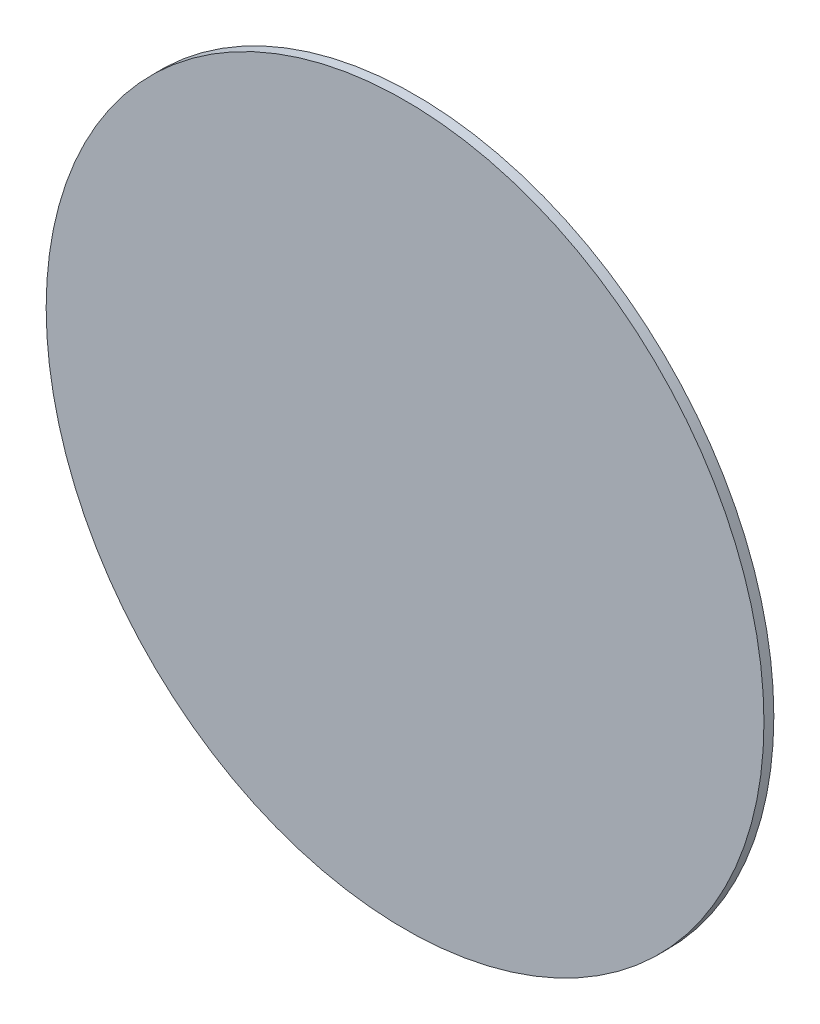
ISO-10303-21;
HEADER;
FILE_DESCRIPTION(('STEP AP214'),'2;1');
FILE_NAME('part.step','',(''),(''),'','','');
FILE_SCHEMA(('AUTOMOTIVE_DESIGN { 1 0 10303 214 1 1 1 1 }'));
ENDSEC;
DATA;
#1=APPLICATION_CONTEXT('core data for automotive mechanical design processes');
#2=APPLICATION_PROTOCOL_DEFINITION('international standard','automotive_design',2000,#1);
#3=PRODUCT_CONTEXT('',#1,'mechanical');
#4=PRODUCT('Part','Part','',(#3));
#5=PRODUCT_RELATED_PRODUCT_CATEGORY('part','',(#4));
#6=PRODUCT_DEFINITION_FORMATION('','',#4);
#7=PRODUCT_DEFINITION_CONTEXT('part definition',#1,'design');
#8=PRODUCT_DEFINITION('design','',#6,#7);
#9=PRODUCT_DEFINITION_SHAPE('','',#8);
#10=(LENGTH_UNIT() NAMED_UNIT(*) SI_UNIT(.MILLI.,.METRE.));
#11=(NAMED_UNIT(*) PLANE_ANGLE_UNIT() SI_UNIT($,.RADIAN.));
#12=(NAMED_UNIT(*) SI_UNIT($,.STERADIAN.) SOLID_ANGLE_UNIT());
#13=UNCERTAINTY_MEASURE_WITH_UNIT(LENGTH_MEASURE(1.E-05),#10,'distance_accuracy_value','');
#14=(GEOMETRIC_REPRESENTATION_CONTEXT(3) GLOBAL_UNCERTAINTY_ASSIGNED_CONTEXT((#13)) GLOBAL_UNIT_ASSIGNED_CONTEXT((#10,
#11,#12)) REPRESENTATION_CONTEXT('',''));
#15=CARTESIAN_POINT('',(0.,0.,0.));
#16=DIRECTION('',(0.,0.,1.));
#17=DIRECTION('',(1.,0.,0.));
#18=AXIS2_PLACEMENT_3D('',#15,#16,#17);
#19=CARTESIAN_POINT('',(0.,0.,10.));
#20=DIRECTION('',(0.,0.,-1.));
#21=DIRECTION('',(-1.,0.,0.));
#22=AXIS2_PLACEMENT_3D('',#19,#20,#21);
#23=CYLINDRICAL_SURFACE('',#22,363.2);
#24=CARTESIAN_POINT('',(0.,0.,10.));
#25=DIRECTION('',(0.,0.,1.));
#26=DIRECTION('',(1.,0.,0.));
#27=AXIS2_PLACEMENT_3D('',#24,#25,#26);
#28=CIRCLE('',#27,363.2);
#29=CARTESIAN_POINT('',(363.2,0.,10.));
#30=VERTEX_POINT('',#29);
#31=EDGE_CURVE('E10',#30,#30,#28,.T.);
#32=ORIENTED_EDGE('',*,*,#31,.F.);
#33=EDGE_LOOP('',(#32));
#34=FACE_BOUND('',#33,.T.);
#35=CARTESIAN_POINT('',(0.,0.,0.));
#36=DIRECTION('',(0.,0.,1.));
#37=DIRECTION('',(1.,0.,0.));
#38=AXIS2_PLACEMENT_3D('',#35,#36,#37);
#39=CIRCLE('',#38,363.2);
#40=CARTESIAN_POINT('',(363.2,0.,0.));
#41=VERTEX_POINT('',#40);
#42=EDGE_CURVE('E46',#41,#41,#39,.T.);
#43=ORIENTED_EDGE('',*,*,#42,.T.);
#44=EDGE_LOOP('',(#43));
#45=FACE_BOUND('',#44,.T.);
#46=ADVANCED_FACE('F43',(#34,#45),#23,.T.);
#47=CARTESIAN_POINT('',(0.,0.,10.));
#48=DIRECTION('',(0.,0.,1.));
#49=DIRECTION('',(1.,0.,0.));
#50=AXIS2_PLACEMENT_3D('',#47,#48,#49);
#51=PLANE('',#50);
#52=ORIENTED_EDGE('',*,*,#31,.T.);
#53=EDGE_LOOP('',(#52));
#54=FACE_BOUND('',#53,.T.);
#55=ADVANCED_FACE('F60',(#54),#51,.T.);
#56=CARTESIAN_POINT('',(0.,0.,0.));
#57=DIRECTION('',(0.,0.,1.));
#58=DIRECTION('',(1.,0.,0.));
#59=AXIS2_PLACEMENT_3D('',#56,#57,#58);
#60=PLANE('',#59);
#61=ORIENTED_EDGE('',*,*,#42,.F.);
#62=EDGE_LOOP('',(#61));
#63=FACE_BOUND('',#62,.T.);
#64=ADVANCED_FACE('F58',(#63),#60,.F.);
#65=CLOSED_SHELL('',(#46,#55,#64));
#66=MANIFOLD_SOLID_BREP('B2',#65);
#67=ADVANCED_BREP_SHAPE_REPRESENTATION('',(#18,#66),#14);
#68=SHAPE_DEFINITION_REPRESENTATION(#9,#67);
ENDSEC;
END-ISO-10303-21;
